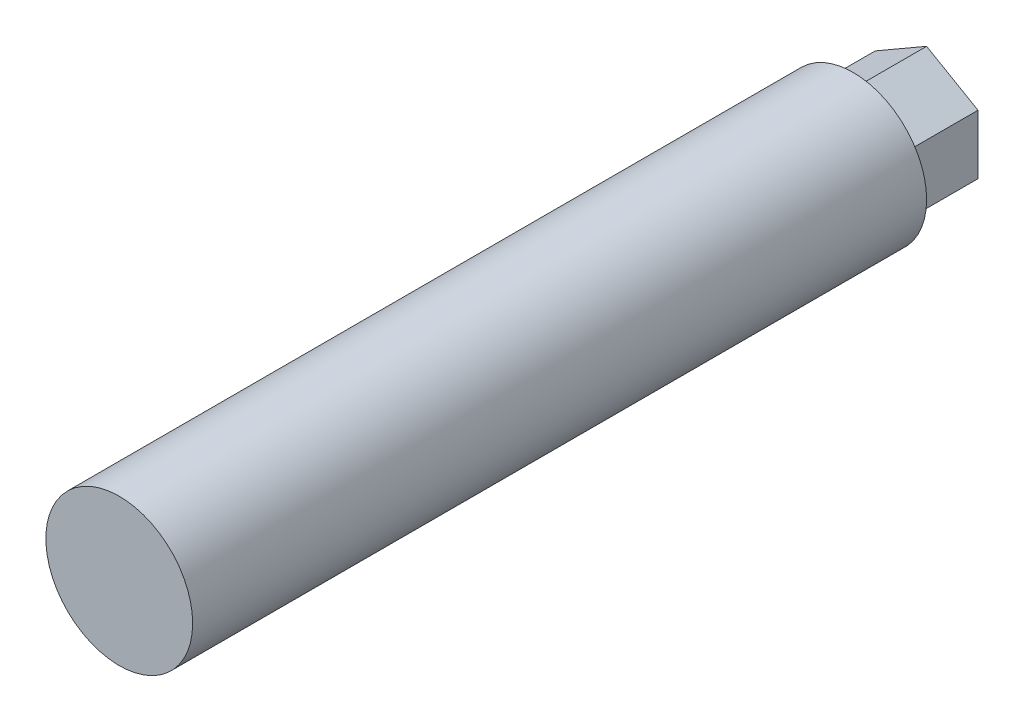
ISO-10303-21;
HEADER;
FILE_DESCRIPTION(('STEP AP214'),'2;1');
FILE_NAME('part.step','',(''),(''),'','','');
FILE_SCHEMA(('AUTOMOTIVE_DESIGN { 1 0 10303 214 1 1 1 1 }'));
ENDSEC;
DATA;
#1=APPLICATION_CONTEXT('core data for automotive mechanical design processes');
#2=APPLICATION_PROTOCOL_DEFINITION('international standard','automotive_design',2000,#1);
#3=PRODUCT_CONTEXT('',#1,'mechanical');
#4=PRODUCT('Part','Part','',(#3));
#5=PRODUCT_RELATED_PRODUCT_CATEGORY('part','',(#4));
#6=PRODUCT_DEFINITION_FORMATION('','',#4);
#7=PRODUCT_DEFINITION_CONTEXT('part definition',#1,'design');
#8=PRODUCT_DEFINITION('design','',#6,#7);
#9=PRODUCT_DEFINITION_SHAPE('','',#8);
#10=(LENGTH_UNIT() NAMED_UNIT(*) SI_UNIT(.MILLI.,.METRE.));
#11=(NAMED_UNIT(*) PLANE_ANGLE_UNIT() SI_UNIT($,.RADIAN.));
#12=(NAMED_UNIT(*) SI_UNIT($,.STERADIAN.) SOLID_ANGLE_UNIT());
#13=UNCERTAINTY_MEASURE_WITH_UNIT(LENGTH_MEASURE(1.E-05),#10,'distance_accuracy_value','');
#14=(GEOMETRIC_REPRESENTATION_CONTEXT(3) GLOBAL_UNCERTAINTY_ASSIGNED_CONTEXT((#13)) GLOBAL_UNIT_ASSIGNED_CONTEXT((#10,
#11,#12)) REPRESENTATION_CONTEXT('',''));
#15=CARTESIAN_POINT('',(0.,0.,0.));
#16=DIRECTION('',(0.,0.,1.));
#17=DIRECTION('',(1.,0.,0.));
#18=AXIS2_PLACEMENT_3D('',#15,#16,#17);
#19=CARTESIAN_POINT('',(0.,0.,0.));
#20=DIRECTION('',(0.,0.,1.));
#21=DIRECTION('',(1.,0.,0.));
#22=AXIS2_PLACEMENT_3D('',#19,#20,#21);
#23=PLANE('',#22);
#24=CARTESIAN_POINT('',(0.,0.,0.));
#25=DIRECTION('',(0.,0.,1.));
#26=DIRECTION('',(1.,0.,0.));
#27=AXIS2_PLACEMENT_3D('',#24,#25,#26);
#28=CIRCLE('',#27,5.);
#29=CARTESIAN_POINT('',(5.,0.,0.));
#30=VERTEX_POINT('',#29);
#31=EDGE_CURVE('E43',#30,#30,#28,.T.);
#32=ORIENTED_EDGE('',*,*,#31,.F.);
#33=EDGE_LOOP('',(#32));
#34=FACE_BOUND('',#33,.T.);
#35=DIRECTION('',(0.866025403784439,0.5,0.));
#36=VECTOR('',#35,1.);
#37=CARTESIAN_POINT('',(-3.5,2.02072594216369,0.));
#38=LINE('',#37,#36);
#39=CARTESIAN_POINT('',(-3.5,2.02072594216369,0.));
#40=VERTEX_POINT('',#39);
#41=CARTESIAN_POINT('',(0.,4.04145188432738,0.));
#42=VERTEX_POINT('',#41);
#43=EDGE_CURVE('E55',#40,#42,#38,.T.);
#44=ORIENTED_EDGE('',*,*,#43,.F.);
#45=DIRECTION('',(0.,1.,0.));
#46=VECTOR('',#45,1.);
#47=CARTESIAN_POINT('',(-3.5,-2.02072594216369,0.));
#48=LINE('',#47,#46);
#49=CARTESIAN_POINT('',(-3.5,-2.02072594216369,0.));
#50=VERTEX_POINT('',#49);
#51=EDGE_CURVE('E59',#50,#40,#48,.T.);
#52=ORIENTED_EDGE('',*,*,#51,.F.);
#53=DIRECTION('',(-0.866025403784439,0.5,0.));
#54=VECTOR('',#53,1.);
#55=CARTESIAN_POINT('',(0.,-4.04145188432738,0.));
#56=LINE('',#55,#54);
#57=CARTESIAN_POINT('',(0.,-4.04145188432738,0.));
#58=VERTEX_POINT('',#57);
#59=EDGE_CURVE('E139',#58,#50,#56,.T.);
#60=ORIENTED_EDGE('',*,*,#59,.F.);
#61=DIRECTION('',(-0.866025403784439,-0.5,0.));
#62=VECTOR('',#61,1.);
#63=CARTESIAN_POINT('',(3.5,-2.02072594216369,0.));
#64=LINE('',#63,#62);
#65=CARTESIAN_POINT('',(3.5,-2.02072594216369,0.));
#66=VERTEX_POINT('',#65);
#67=EDGE_CURVE('E142',#66,#58,#64,.T.);
#68=ORIENTED_EDGE('',*,*,#67,.F.);
#69=DIRECTION('',(0.,-1.,0.));
#70=VECTOR('',#69,1.);
#71=CARTESIAN_POINT('',(3.5,2.02072594216369,0.));
#72=LINE('',#71,#70);
#73=CARTESIAN_POINT('',(3.5,2.02072594216369,0.));
#74=VERTEX_POINT('',#73);
#75=EDGE_CURVE('E146',#74,#66,#72,.T.);
#76=ORIENTED_EDGE('',*,*,#75,.F.);
#77=DIRECTION('',(0.866025403784439,-0.5,0.));
#78=VECTOR('',#77,1.);
#79=CARTESIAN_POINT('',(0.,4.04145188432738,0.));
#80=LINE('',#79,#78);
#81=EDGE_CURVE('E150',#42,#74,#80,.T.);
#82=ORIENTED_EDGE('',*,*,#81,.F.);
#83=EDGE_LOOP('',(#44,#52,#60,#68,#76,#82));
#84=FACE_BOUND('',#83,.T.);
#85=ADVANCED_FACE('F39',(#34,#84),#23,.F.);
#86=CARTESIAN_POINT('',(0.,0.,50.));
#87=DIRECTION('',(0.,0.,-1.));
#88=DIRECTION('',(-1.,0.,0.));
#89=AXIS2_PLACEMENT_3D('',#86,#87,#88);
#90=CYLINDRICAL_SURFACE('',#89,5.);
#91=CARTESIAN_POINT('',(0.,0.,50.));
#92=DIRECTION('',(0.,0.,1.));
#93=DIRECTION('',(1.,0.,0.));
#94=AXIS2_PLACEMENT_3D('',#91,#92,#93);
#95=CIRCLE('',#94,5.);
#96=CARTESIAN_POINT('',(5.,0.,50.));
#97=VERTEX_POINT('',#96);
#98=EDGE_CURVE('E11',#97,#97,#95,.T.);
#99=ORIENTED_EDGE('',*,*,#98,.F.);
#100=EDGE_LOOP('',(#99));
#101=FACE_BOUND('',#100,.T.);
#102=ORIENTED_EDGE('',*,*,#31,.T.);
#103=EDGE_LOOP('',(#102));
#104=FACE_BOUND('',#103,.T.);
#105=ADVANCED_FACE('F41',(#101,#104),#90,.T.);
#106=CARTESIAN_POINT('',(0.,0.,50.));
#107=DIRECTION('',(0.,0.,1.));
#108=DIRECTION('',(1.,0.,0.));
#109=AXIS2_PLACEMENT_3D('',#106,#107,#108);
#110=PLANE('',#109);
#111=ORIENTED_EDGE('',*,*,#98,.T.);
#112=EDGE_LOOP('',(#111));
#113=FACE_BOUND('',#112,.T.);
#114=ADVANCED_FACE('F190',(#113),#110,.T.);
#115=CARTESIAN_POINT('',(-3.5,2.02072594216369,-5.));
#116=DIRECTION('',(0.5,-0.866025403784439,0.));
#117=DIRECTION('',(0.866025403784439,0.5,0.));
#118=AXIS2_PLACEMENT_3D('',#115,#116,#117);
#119=PLANE('',#118);
#120=ORIENTED_EDGE('',*,*,#43,.T.);
#121=DIRECTION('',(0.,0.,1.));
#122=VECTOR('',#121,1.);
#123=CARTESIAN_POINT('',(0.,4.04145188432738,-5.));
#124=LINE('',#123,#122);
#125=CARTESIAN_POINT('',(0.,4.04145188432738,-5.));
#126=VERTEX_POINT('',#125);
#127=EDGE_CURVE('E96',#126,#42,#124,.T.);
#128=ORIENTED_EDGE('',*,*,#127,.F.);
#129=DIRECTION('',(0.866025403784439,0.5,0.));
#130=VECTOR('',#129,1.);
#131=CARTESIAN_POINT('',(-3.5,2.02072594216369,-5.));
#132=LINE('',#131,#130);
#133=CARTESIAN_POINT('',(-3.5,2.02072594216369,-5.));
#134=VERTEX_POINT('',#133);
#135=EDGE_CURVE('E103',#134,#126,#132,.T.);
#136=ORIENTED_EDGE('',*,*,#135,.F.);
#137=DIRECTION('',(0.,0.,1.));
#138=VECTOR('',#137,1.);
#139=CARTESIAN_POINT('',(-3.5,2.02072594216369,-5.));
#140=LINE('',#139,#138);
#141=EDGE_CURVE('E134',#134,#40,#140,.T.);
#142=ORIENTED_EDGE('',*,*,#141,.T.);
#143=EDGE_LOOP('',(#120,#128,#136,#142));
#144=FACE_BOUND('',#143,.T.);
#145=ADVANCED_FACE('F114',(#144),#119,.F.);
#146=CARTESIAN_POINT('',(0.,4.04145188432738,-5.));
#147=DIRECTION('',(-0.5,-0.866025403784439,0.));
#148=DIRECTION('',(0.866025403784439,-0.5,0.));
#149=AXIS2_PLACEMENT_3D('',#146,#147,#148);
#150=PLANE('',#149);
#151=ORIENTED_EDGE('',*,*,#81,.T.);
#152=DIRECTION('',(0.,0.,1.));
#153=VECTOR('',#152,1.);
#154=CARTESIAN_POINT('',(3.5,2.02072594216369,-5.));
#155=LINE('',#154,#153);
#156=CARTESIAN_POINT('',(3.5,2.02072594216369,-5.));
#157=VERTEX_POINT('',#156);
#158=EDGE_CURVE('E98',#157,#74,#155,.T.);
#159=ORIENTED_EDGE('',*,*,#158,.F.);
#160=DIRECTION('',(0.866025403784439,-0.5,0.));
#161=VECTOR('',#160,1.);
#162=CARTESIAN_POINT('',(0.,4.04145188432738,-5.));
#163=LINE('',#162,#161);
#164=EDGE_CURVE('E91',#126,#157,#163,.T.);
#165=ORIENTED_EDGE('',*,*,#164,.F.);
#166=ORIENTED_EDGE('',*,*,#127,.T.);
#167=EDGE_LOOP('',(#151,#159,#165,#166));
#168=FACE_BOUND('',#167,.T.);
#169=ADVANCED_FACE('F94',(#168),#150,.F.);
#170=CARTESIAN_POINT('',(3.5,2.02072594216369,-5.));
#171=DIRECTION('',(-1.,0.,0.));
#172=DIRECTION('',(0.,-1.,0.));
#173=AXIS2_PLACEMENT_3D('',#170,#171,#172);
#174=PLANE('',#173);
#175=ORIENTED_EDGE('',*,*,#75,.T.);
#176=DIRECTION('',(0.,0.,1.));
#177=VECTOR('',#176,1.);
#178=CARTESIAN_POINT('',(3.5,-2.02072594216369,-5.));
#179=LINE('',#178,#177);
#180=CARTESIAN_POINT('',(3.5,-2.02072594216369,-5.));
#181=VERTEX_POINT('',#180);
#182=EDGE_CURVE('E120',#181,#66,#179,.T.);
#183=ORIENTED_EDGE('',*,*,#182,.F.);
#184=DIRECTION('',(0.,-1.,0.));
#185=VECTOR('',#184,1.);
#186=CARTESIAN_POINT('',(3.5,2.02072594216369,-5.));
#187=LINE('',#186,#185);
#188=EDGE_CURVE('E102',#157,#181,#187,.T.);
#189=ORIENTED_EDGE('',*,*,#188,.F.);
#190=ORIENTED_EDGE('',*,*,#158,.T.);
#191=EDGE_LOOP('',(#175,#183,#189,#190));
#192=FACE_BOUND('',#191,.T.);
#193=ADVANCED_FACE('F168',(#192),#174,.F.);
#194=CARTESIAN_POINT('',(3.5,-2.02072594216369,-5.));
#195=DIRECTION('',(-0.5,0.866025403784439,0.));
#196=DIRECTION('',(-0.866025403784439,-0.5,0.));
#197=AXIS2_PLACEMENT_3D('',#194,#195,#196);
#198=PLANE('',#197);
#199=ORIENTED_EDGE('',*,*,#67,.T.);
#200=DIRECTION('',(0.,0.,1.));
#201=VECTOR('',#200,1.);
#202=CARTESIAN_POINT('',(0.,-4.04145188432738,-5.));
#203=LINE('',#202,#201);
#204=CARTESIAN_POINT('',(0.,-4.04145188432738,-5.));
#205=VERTEX_POINT('',#204);
#206=EDGE_CURVE('E126',#205,#58,#203,.T.);
#207=ORIENTED_EDGE('',*,*,#206,.F.);
#208=DIRECTION('',(-0.866025403784439,-0.5,0.));
#209=VECTOR('',#208,1.);
#210=CARTESIAN_POINT('',(3.5,-2.02072594216369,-5.));
#211=LINE('',#210,#209);
#212=EDGE_CURVE('E160',#181,#205,#211,.T.);
#213=ORIENTED_EDGE('',*,*,#212,.F.);
#214=ORIENTED_EDGE('',*,*,#182,.T.);
#215=EDGE_LOOP('',(#199,#207,#213,#214));
#216=FACE_BOUND('',#215,.T.);
#217=ADVANCED_FACE('F170',(#216),#198,.F.);
#218=CARTESIAN_POINT('',(0.,-4.04145188432738,-5.));
#219=DIRECTION('',(0.5,0.866025403784439,0.));
#220=DIRECTION('',(-0.866025403784439,0.5,0.));
#221=AXIS2_PLACEMENT_3D('',#218,#219,#220);
#222=PLANE('',#221);
#223=ORIENTED_EDGE('',*,*,#59,.T.);
#224=DIRECTION('',(0.,0.,1.));
#225=VECTOR('',#224,1.);
#226=CARTESIAN_POINT('',(-3.5,-2.02072594216369,-5.));
#227=LINE('',#226,#225);
#228=CARTESIAN_POINT('',(-3.5,-2.02072594216369,-5.));
#229=VERTEX_POINT('',#228);
#230=EDGE_CURVE('E130',#229,#50,#227,.T.);
#231=ORIENTED_EDGE('',*,*,#230,.F.);
#232=DIRECTION('',(-0.866025403784439,0.5,0.));
#233=VECTOR('',#232,1.);
#234=CARTESIAN_POINT('',(0.,-4.04145188432738,-5.));
#235=LINE('',#234,#233);
#236=EDGE_CURVE('E157',#205,#229,#235,.T.);
#237=ORIENTED_EDGE('',*,*,#236,.F.);
#238=ORIENTED_EDGE('',*,*,#206,.T.);
#239=EDGE_LOOP('',(#223,#231,#237,#238));
#240=FACE_BOUND('',#239,.T.);
#241=ADVANCED_FACE('F174',(#240),#222,.F.);
#242=CARTESIAN_POINT('',(-3.5,-2.02072594216369,-5.));
#243=DIRECTION('',(1.,0.,0.));
#244=DIRECTION('',(0.,1.,0.));
#245=AXIS2_PLACEMENT_3D('',#242,#243,#244);
#246=PLANE('',#245);
#247=ORIENTED_EDGE('',*,*,#51,.T.);
#248=ORIENTED_EDGE('',*,*,#141,.F.);
#249=DIRECTION('',(0.,1.,0.));
#250=VECTOR('',#249,1.);
#251=CARTESIAN_POINT('',(-3.5,-2.02072594216369,-5.));
#252=LINE('',#251,#250);
#253=EDGE_CURVE('E108',#229,#134,#252,.T.);
#254=ORIENTED_EDGE('',*,*,#253,.F.);
#255=ORIENTED_EDGE('',*,*,#230,.T.);
#256=EDGE_LOOP('',(#247,#248,#254,#255));
#257=FACE_BOUND('',#256,.T.);
#258=ADVANCED_FACE('F176',(#257),#246,.F.);
#259=CARTESIAN_POINT('',(0.,0.,-5.));
#260=DIRECTION('',(0.,0.,-1.));
#261=DIRECTION('',(-1.,0.,0.));
#262=AXIS2_PLACEMENT_3D('',#259,#260,#261);
#263=PLANE('',#262);
#264=ORIENTED_EDGE('',*,*,#135,.T.);
#265=ORIENTED_EDGE('',*,*,#164,.T.);
#266=ORIENTED_EDGE('',*,*,#188,.T.);
#267=ORIENTED_EDGE('',*,*,#212,.T.);
#268=ORIENTED_EDGE('',*,*,#236,.T.);
#269=ORIENTED_EDGE('',*,*,#253,.T.);
#270=EDGE_LOOP('',(#264,#265,#266,#267,#268,#269));
#271=FACE_BOUND('',#270,.T.);
#272=ADVANCED_FACE('F106',(#271),#263,.T.);
#273=CLOSED_SHELL('',(#85,#105,#114,#145,#169,#193,#217,#241,#258,#272));
#274=MANIFOLD_SOLID_BREP('B2',#273);
#275=ADVANCED_BREP_SHAPE_REPRESENTATION('',(#18,#274),#14);
#276=SHAPE_DEFINITION_REPRESENTATION(#9,#275);
ENDSEC;
END-ISO-10303-21;
